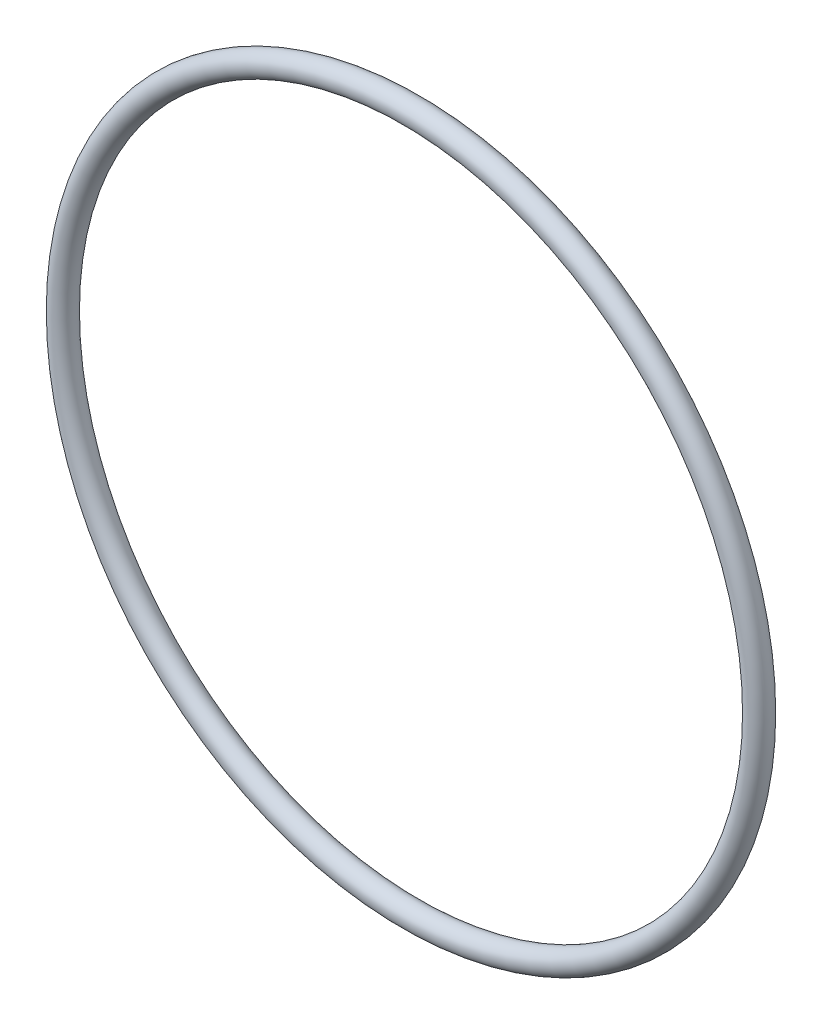
ISO-10303-21;
HEADER;
FILE_DESCRIPTION(('STEP AP214'),'2;1');
FILE_NAME('part.step','',(''),(''),'','','');
FILE_SCHEMA(('AUTOMOTIVE_DESIGN { 1 0 10303 214 1 1 1 1 }'));
ENDSEC;
DATA;
#1=APPLICATION_CONTEXT('core data for automotive mechanical design processes');
#2=APPLICATION_PROTOCOL_DEFINITION('international standard','automotive_design',2000,#1);
#3=PRODUCT_CONTEXT('',#1,'mechanical');
#4=PRODUCT('Part','Part','',(#3));
#5=PRODUCT_RELATED_PRODUCT_CATEGORY('part','',(#4));
#6=PRODUCT_DEFINITION_FORMATION('','',#4);
#7=PRODUCT_DEFINITION_CONTEXT('part definition',#1,'design');
#8=PRODUCT_DEFINITION('design','',#6,#7);
#9=PRODUCT_DEFINITION_SHAPE('','',#8);
#10=(LENGTH_UNIT() NAMED_UNIT(*) SI_UNIT(.MILLI.,.METRE.));
#11=(NAMED_UNIT(*) PLANE_ANGLE_UNIT() SI_UNIT($,.RADIAN.));
#12=(NAMED_UNIT(*) SI_UNIT($,.STERADIAN.) SOLID_ANGLE_UNIT());
#13=UNCERTAINTY_MEASURE_WITH_UNIT(LENGTH_MEASURE(1.E-05),#10,'distance_accuracy_value','');
#14=(GEOMETRIC_REPRESENTATION_CONTEXT(3) GLOBAL_UNCERTAINTY_ASSIGNED_CONTEXT((#13)) GLOBAL_UNIT_ASSIGNED_CONTEXT((#10,
#11,#12)) REPRESENTATION_CONTEXT('',''));
#15=CARTESIAN_POINT('',(0.,0.,0.));
#16=DIRECTION('',(0.,0.,1.));
#17=DIRECTION('',(1.,0.,0.));
#18=AXIS2_PLACEMENT_3D('',#15,#16,#17);
#19=CARTESIAN_POINT('',(0.,0.,0.));
#20=DIRECTION('',(0.,0.,1.));
#21=DIRECTION('',(1.,0.,0.));
#22=AXIS2_PLACEMENT_3D('',#19,#20,#21);
#23=TOROIDAL_SURFACE('',#22,52.3621,1.76530000000001);
#24=CARTESIAN_POINT('',(54.1274,0.,0.));
#25=VERTEX_POINT('',#24);
#26=VERTEX_LOOP('',#25);
#27=FACE_BOUND('',#26,.T.);
#28=ADVANCED_FACE('F32',(#27),#23,.T.);
#29=CLOSED_SHELL('',(#28));
#30=MANIFOLD_SOLID_BREP('B2',#29);
#31=ADVANCED_BREP_SHAPE_REPRESENTATION('',(#18,#30),#14);
#32=SHAPE_DEFINITION_REPRESENTATION(#9,#31);
ENDSEC;
END-ISO-10303-21;
